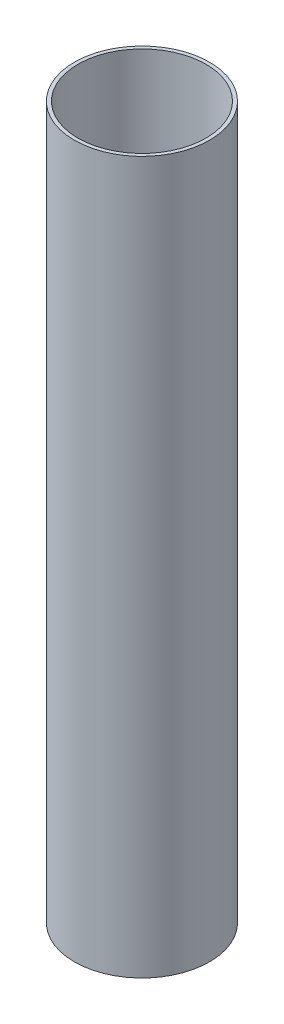
ISO-10303-21;
HEADER;
FILE_DESCRIPTION(('STEP AP214'),'2;1');
FILE_NAME('part.step','',(''),(''),'','','');
FILE_SCHEMA(('AUTOMOTIVE_DESIGN { 1 0 10303 214 1 1 1 1 }'));
ENDSEC;
DATA;
#1=APPLICATION_CONTEXT('core data for automotive mechanical design processes');
#2=APPLICATION_PROTOCOL_DEFINITION('international standard','automotive_design',2000,#1);
#3=PRODUCT_CONTEXT('',#1,'mechanical');
#4=PRODUCT('Part','Part','',(#3));
#5=PRODUCT_RELATED_PRODUCT_CATEGORY('part','',(#4));
#6=PRODUCT_DEFINITION_FORMATION('','',#4);
#7=PRODUCT_DEFINITION_CONTEXT('part definition',#1,'design');
#8=PRODUCT_DEFINITION('design','',#6,#7);
#9=PRODUCT_DEFINITION_SHAPE('','',#8);
#10=(LENGTH_UNIT() NAMED_UNIT(*) SI_UNIT(.MILLI.,.METRE.));
#11=(NAMED_UNIT(*) PLANE_ANGLE_UNIT() SI_UNIT($,.RADIAN.));
#12=(NAMED_UNIT(*) SI_UNIT($,.STERADIAN.) SOLID_ANGLE_UNIT());
#13=UNCERTAINTY_MEASURE_WITH_UNIT(LENGTH_MEASURE(1.E-05),#10,'distance_accuracy_value','');
#14=(GEOMETRIC_REPRESENTATION_CONTEXT(3) GLOBAL_UNCERTAINTY_ASSIGNED_CONTEXT((#13)) GLOBAL_UNIT_ASSIGNED_CONTEXT((#10,
#11,#12)) REPRESENTATION_CONTEXT('',''));
#15=CARTESIAN_POINT('',(0.,0.,0.));
#16=DIRECTION('',(0.,0.,1.));
#17=DIRECTION('',(1.,0.,0.));
#18=AXIS2_PLACEMENT_3D('',#15,#16,#17);
#19=CARTESIAN_POINT('',(0.,200.,0.));
#20=DIRECTION('',(0.,1.,0.));
#21=DIRECTION('',(0.,0.,1.));
#22=AXIS2_PLACEMENT_3D('',#19,#20,#21);
#23=PLANE('',#22);
#24=CARTESIAN_POINT('',(0.,200.,0.));
#25=DIRECTION('',(0.,1.,0.));
#26=DIRECTION('',(0.,0.,1.));
#27=AXIS2_PLACEMENT_3D('',#24,#25,#26);
#28=CIRCLE('',#27,19.);
#29=CARTESIAN_POINT('',(0.,200.,19.));
#30=VERTEX_POINT('',#29);
#31=EDGE_CURVE('E10',#30,#30,#28,.T.);
#32=ORIENTED_EDGE('',*,*,#31,.T.);
#33=EDGE_LOOP('',(#32));
#34=FACE_BOUND('',#33,.T.);
#35=CARTESIAN_POINT('',(0.,200.,0.));
#36=DIRECTION('',(0.,1.,0.));
#37=DIRECTION('',(0.,0.,1.));
#38=AXIS2_PLACEMENT_3D('',#35,#36,#37);
#39=CIRCLE('',#38,18.);
#40=CARTESIAN_POINT('',(0.,200.,18.));
#41=VERTEX_POINT('',#40);
#42=EDGE_CURVE('E44',#41,#41,#39,.T.);
#43=ORIENTED_EDGE('',*,*,#42,.F.);
#44=EDGE_LOOP('',(#43));
#45=FACE_BOUND('',#44,.T.);
#46=ADVANCED_FACE('F33',(#34,#45),#23,.T.);
#47=CARTESIAN_POINT('',(0.,0.,0.));
#48=DIRECTION('',(0.,1.,0.));
#49=DIRECTION('',(0.,0.,1.));
#50=AXIS2_PLACEMENT_3D('',#47,#48,#49);
#51=PLANE('',#50);
#52=CARTESIAN_POINT('',(0.,0.,0.));
#53=DIRECTION('',(0.,1.,0.));
#54=DIRECTION('',(0.,0.,1.));
#55=AXIS2_PLACEMENT_3D('',#52,#53,#54);
#56=CIRCLE('',#55,19.);
#57=CARTESIAN_POINT('',(0.,0.,19.));
#58=VERTEX_POINT('',#57);
#59=EDGE_CURVE('E37',#58,#58,#56,.T.);
#60=ORIENTED_EDGE('',*,*,#59,.F.);
#61=EDGE_LOOP('',(#60));
#62=FACE_BOUND('',#61,.T.);
#63=CARTESIAN_POINT('',(0.,0.,0.));
#64=DIRECTION('',(0.,1.,0.));
#65=DIRECTION('',(0.,0.,1.));
#66=AXIS2_PLACEMENT_3D('',#63,#64,#65);
#67=CIRCLE('',#66,18.);
#68=CARTESIAN_POINT('',(0.,0.,18.));
#69=VERTEX_POINT('',#68);
#70=EDGE_CURVE('E46',#69,#69,#67,.T.);
#71=ORIENTED_EDGE('',*,*,#70,.T.);
#72=EDGE_LOOP('',(#71));
#73=FACE_BOUND('',#72,.T.);
#74=ADVANCED_FACE('F56',(#62,#73),#51,.F.);
#75=CARTESIAN_POINT('',(0.,200.,0.));
#76=DIRECTION('',(0.,-1.,0.));
#77=DIRECTION('',(0.,0.,-1.));
#78=AXIS2_PLACEMENT_3D('',#75,#76,#77);
#79=CYLINDRICAL_SURFACE('',#78,19.);
#80=ORIENTED_EDGE('',*,*,#31,.F.);
#81=EDGE_LOOP('',(#80));
#82=FACE_BOUND('',#81,.T.);
#83=ORIENTED_EDGE('',*,*,#59,.T.);
#84=EDGE_LOOP('',(#83));
#85=FACE_BOUND('',#84,.T.);
#86=ADVANCED_FACE('F35',(#82,#85),#79,.T.);
#87=CARTESIAN_POINT('',(0.,200.,0.));
#88=DIRECTION('',(0.,-1.,0.));
#89=DIRECTION('',(0.,0.,-1.));
#90=AXIS2_PLACEMENT_3D('',#87,#88,#89);
#91=CYLINDRICAL_SURFACE('',#90,18.);
#92=ORIENTED_EDGE('',*,*,#42,.T.);
#93=EDGE_LOOP('',(#92));
#94=FACE_BOUND('',#93,.T.);
#95=ORIENTED_EDGE('',*,*,#70,.F.);
#96=EDGE_LOOP('',(#95));
#97=FACE_BOUND('',#96,.T.);
#98=ADVANCED_FACE('F52',(#94,#97),#91,.F.);
#99=CLOSED_SHELL('',(#46,#74,#86,#98));
#100=MANIFOLD_SOLID_BREP('B2',#99);
#101=ADVANCED_BREP_SHAPE_REPRESENTATION('',(#18,#100),#14);
#102=SHAPE_DEFINITION_REPRESENTATION(#9,#101);
ENDSEC;
END-ISO-10303-21;
